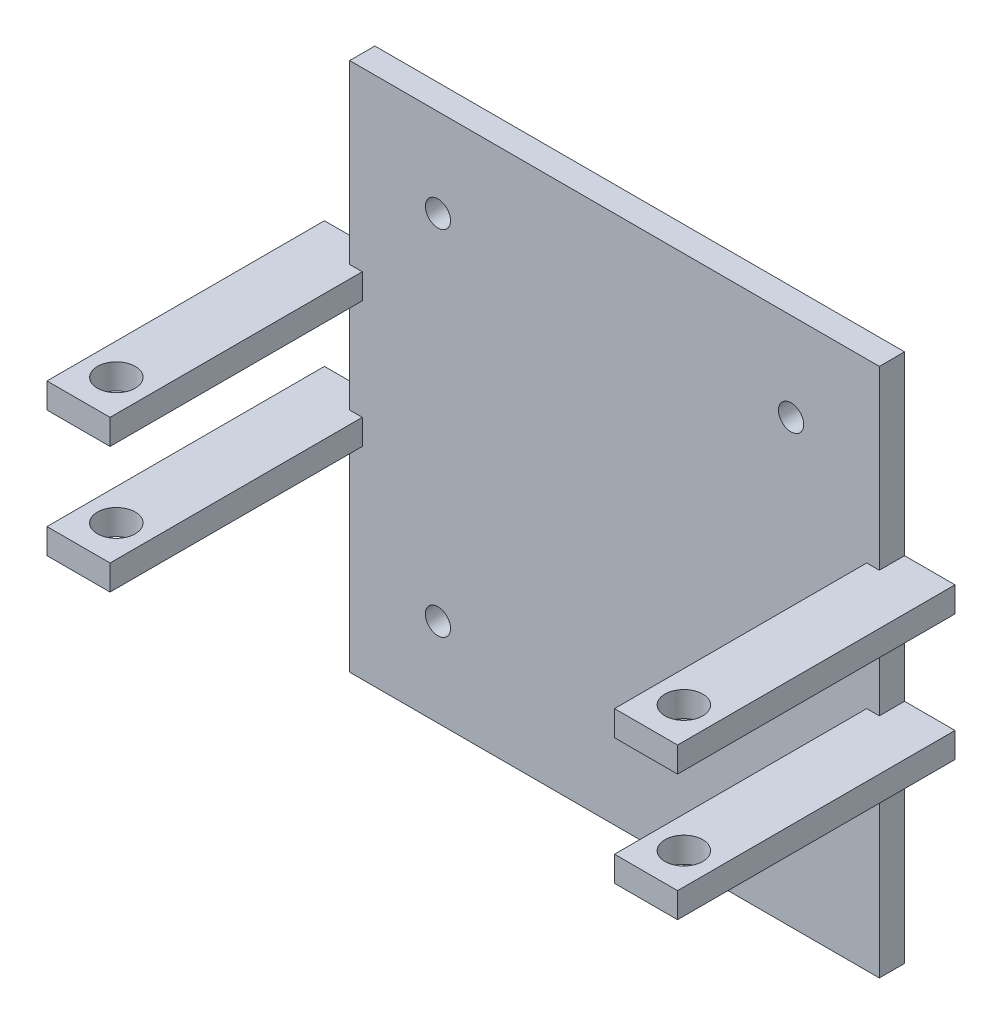
ISO-10303-21;
HEADER;
FILE_DESCRIPTION(('STEP AP214'),'2;1');
FILE_NAME('part.step','',(''),(''),'','','');
FILE_SCHEMA(('AUTOMOTIVE_DESIGN { 1 0 10303 214 1 1 1 1 }'));
ENDSEC;
DATA;
#1=APPLICATION_CONTEXT('core data for automotive mechanical design processes');
#2=APPLICATION_PROTOCOL_DEFINITION('international standard','automotive_design',2000,#1);
#3=PRODUCT_CONTEXT('',#1,'mechanical');
#4=PRODUCT('Part','Part','',(#3));
#5=PRODUCT_RELATED_PRODUCT_CATEGORY('part','',(#4));
#6=PRODUCT_DEFINITION_FORMATION('','',#4);
#7=PRODUCT_DEFINITION_CONTEXT('part definition',#1,'design');
#8=PRODUCT_DEFINITION('design','',#6,#7);
#9=PRODUCT_DEFINITION_SHAPE('','',#8);
#10=(LENGTH_UNIT() NAMED_UNIT(*) SI_UNIT(.MILLI.,.METRE.));
#11=(NAMED_UNIT(*) PLANE_ANGLE_UNIT() SI_UNIT($,.RADIAN.));
#12=(NAMED_UNIT(*) SI_UNIT($,.STERADIAN.) SOLID_ANGLE_UNIT());
#13=UNCERTAINTY_MEASURE_WITH_UNIT(LENGTH_MEASURE(1.E-05),#10,'distance_accuracy_value','');
#14=(GEOMETRIC_REPRESENTATION_CONTEXT(3) GLOBAL_UNCERTAINTY_ASSIGNED_CONTEXT((#13)) GLOBAL_UNIT_ASSIGNED_CONTEXT((#10,
#11,#12)) REPRESENTATION_CONTEXT('',''));
#15=CARTESIAN_POINT('',(0.,0.,0.));
#16=DIRECTION('',(0.,0.,1.));
#17=DIRECTION('',(1.,0.,0.));
#18=AXIS2_PLACEMENT_3D('',#15,#16,#17);
#19=CARTESIAN_POINT('',(-25.8385690789474,-6.14671052631578,0.));
#20=DIRECTION('',(0.,-1.,0.));
#21=DIRECTION('',(0.,0.,-1.));
#22=AXIS2_PLACEMENT_3D('',#19,#20,#21);
#23=PLANE('',#22);
#24=CARTESIAN_POINT('',(-23.3385690789474,-6.14671052631578,19.));
#25=DIRECTION('',(0.,-1.,0.));
#26=DIRECTION('',(0.,0.,-1.));
#27=AXIS2_PLACEMENT_3D('',#24,#25,#26);
#28=CIRCLE('',#27,1.5);
#29=CARTESIAN_POINT('',(-23.3385690789474,-6.14671052631578,17.5));
#30=VERTEX_POINT('',#29);
#31=EDGE_CURVE('E242',#30,#30,#28,.T.);
#32=ORIENTED_EDGE('',*,*,#31,.T.);
#33=EDGE_LOOP('',(#32));
#34=FACE_BOUND('',#33,.T.);
#35=DIRECTION('',(1.,0.,0.));
#36=VECTOR('',#35,1.);
#37=CARTESIAN_POINT('',(-25.8385690789474,-6.14671052631578,22.));
#38=LINE('',#37,#36);
#39=CARTESIAN_POINT('',(-25.8385690789474,-6.14671052631578,22.));
#40=VERTEX_POINT('',#39);
#41=CARTESIAN_POINT('',(-20.8385690789474,-6.14671052631578,22.));
#42=VERTEX_POINT('',#41);
#43=EDGE_CURVE('E267',#40,#42,#38,.T.);
#44=ORIENTED_EDGE('',*,*,#43,.T.);
#45=DIRECTION('',(0.,0.,1.));
#46=VECTOR('',#45,1.);
#47=CARTESIAN_POINT('',(-20.8385690789474,-6.14671052631578,-38.0499687890016));
#48=LINE('',#47,#46);
#49=CARTESIAN_POINT('',(-20.8385690789474,-6.14671052631578,2.));
#50=VERTEX_POINT('',#49);
#51=EDGE_CURVE('E235',#50,#42,#48,.T.);
#52=ORIENTED_EDGE('',*,*,#51,.F.);
#53=DIRECTION('',(1.,0.,0.));
#54=VECTOR('',#53,1.);
#55=CARTESIAN_POINT('',(0.,-6.14671052631578,2.));
#56=LINE('',#55,#54);
#57=CARTESIAN_POINT('',(-21.8385690789474,-6.14671052631578,2.));
#58=VERTEX_POINT('',#57);
#59=EDGE_CURVE('E312',#58,#50,#56,.T.);
#60=ORIENTED_EDGE('',*,*,#59,.F.);
#61=DIRECTION('',(0.,0.,-1.));
#62=VECTOR('',#61,1.);
#63=CARTESIAN_POINT('',(-21.8385690789474,-6.14671052631578,2.));
#64=LINE('',#63,#62);
#65=CARTESIAN_POINT('',(-21.8385690789474,-6.14671052631578,0.));
#66=VERTEX_POINT('',#65);
#67=EDGE_CURVE('E320',#58,#66,#64,.T.);
#68=ORIENTED_EDGE('',*,*,#67,.T.);
#69=DIRECTION('',(1.,0.,0.));
#70=VECTOR('',#69,1.);
#71=CARTESIAN_POINT('',(-25.8385690789474,-6.14671052631578,0.));
#72=LINE('',#71,#70);
#73=CARTESIAN_POINT('',(-25.8385690789474,-6.14671052631578,0.));
#74=VERTEX_POINT('',#73);
#75=EDGE_CURVE('E284',#74,#66,#72,.T.);
#76=ORIENTED_EDGE('',*,*,#75,.F.);
#77=DIRECTION('',(0.,0.,1.));
#78=VECTOR('',#77,1.);
#79=CARTESIAN_POINT('',(-25.8385690789474,-6.14671052631578,0.));
#80=LINE('',#79,#78);
#81=EDGE_CURVE('E289',#74,#40,#80,.T.);
#82=ORIENTED_EDGE('',*,*,#81,.T.);
#83=EDGE_LOOP('',(#44,#52,#60,#68,#76,#82));
#84=FACE_BOUND('',#83,.T.);
#85=ADVANCED_FACE('F41',(#34,#84),#23,.F.);
#86=CARTESIAN_POINT('',(-25.8385690789474,-8.14671052631578,0.));
#87=DIRECTION('',(0.,-1.,0.));
#88=DIRECTION('',(0.,0.,-1.));
#89=AXIS2_PLACEMENT_3D('',#86,#87,#88);
#90=PLANE('',#89);
#91=CARTESIAN_POINT('',(-23.3385690789474,-8.14671052631578,19.));
#92=DIRECTION('',(0.,-1.,0.));
#93=DIRECTION('',(0.,0.,-1.));
#94=AXIS2_PLACEMENT_3D('',#91,#92,#93);
#95=CIRCLE('',#94,1.5);
#96=CARTESIAN_POINT('',(-23.3385690789474,-8.14671052631578,17.5));
#97=VERTEX_POINT('',#96);
#98=EDGE_CURVE('E504',#97,#97,#95,.T.);
#99=ORIENTED_EDGE('',*,*,#98,.F.);
#100=EDGE_LOOP('',(#99));
#101=FACE_BOUND('',#100,.T.);
#102=DIRECTION('',(0.,0.,1.));
#103=VECTOR('',#102,1.);
#104=CARTESIAN_POINT('',(-20.8385690789474,-8.14671052631578,-38.0499687890016));
#105=LINE('',#104,#103);
#106=CARTESIAN_POINT('',(-20.8385690789474,-8.14671052631578,2.));
#107=VERTEX_POINT('',#106);
#108=CARTESIAN_POINT('',(-20.8385690789474,-8.14671052631578,22.));
#109=VERTEX_POINT('',#108);
#110=EDGE_CURVE('E232',#107,#109,#105,.T.);
#111=ORIENTED_EDGE('',*,*,#110,.T.);
#112=DIRECTION('',(1.,0.,0.));
#113=VECTOR('',#112,1.);
#114=CARTESIAN_POINT('',(-25.8385690789474,-8.14671052631578,22.));
#115=LINE('',#114,#113);
#116=CARTESIAN_POINT('',(-25.8385690789474,-8.14671052631578,22.));
#117=VERTEX_POINT('',#116);
#118=EDGE_CURVE('E247',#117,#109,#115,.T.);
#119=ORIENTED_EDGE('',*,*,#118,.F.);
#120=DIRECTION('',(0.,0.,1.));
#121=VECTOR('',#120,1.);
#122=CARTESIAN_POINT('',(-25.8385690789474,-8.14671052631578,0.));
#123=LINE('',#122,#121);
#124=CARTESIAN_POINT('',(-25.8385690789474,-8.14671052631578,0.));
#125=VERTEX_POINT('',#124);
#126=EDGE_CURVE('E288',#125,#117,#123,.T.);
#127=ORIENTED_EDGE('',*,*,#126,.F.);
#128=DIRECTION('',(1.,0.,0.));
#129=VECTOR('',#128,1.);
#130=CARTESIAN_POINT('',(-25.8385690789474,-8.14671052631578,0.));
#131=LINE('',#130,#129);
#132=CARTESIAN_POINT('',(-21.8385690789474,-8.14671052631578,0.));
#133=VERTEX_POINT('',#132);
#134=EDGE_CURVE('E275',#125,#133,#131,.T.);
#135=ORIENTED_EDGE('',*,*,#134,.T.);
#136=DIRECTION('',(0.,0.,-1.));
#137=VECTOR('',#136,1.);
#138=CARTESIAN_POINT('',(-21.8385690789474,-8.14671052631578,2.));
#139=LINE('',#138,#137);
#140=CARTESIAN_POINT('',(-21.8385690789474,-8.14671052631578,2.));
#141=VERTEX_POINT('',#140);
#142=EDGE_CURVE('E309',#141,#133,#139,.T.);
#143=ORIENTED_EDGE('',*,*,#142,.F.);
#144=DIRECTION('',(1.,0.,0.));
#145=VECTOR('',#144,1.);
#146=CARTESIAN_POINT('',(0.,-8.14671052631578,2.));
#147=LINE('',#146,#145);
#148=EDGE_CURVE('E250',#141,#107,#147,.T.);
#149=ORIENTED_EDGE('',*,*,#148,.T.);
#150=EDGE_LOOP('',(#111,#119,#127,#135,#143,#149));
#151=FACE_BOUND('',#150,.T.);
#152=ADVANCED_FACE('F246',(#101,#151),#90,.T.);
#153=CARTESIAN_POINT('',(0.,-10.,22.));
#154=DIRECTION('',(0.,0.,1.));
#155=DIRECTION('',(1.,0.,0.));
#156=AXIS2_PLACEMENT_3D('',#153,#154,#155);
#157=PLANE('',#156);
#158=DIRECTION('',(0.,-1.,0.));
#159=VECTOR('',#158,1.);
#160=CARTESIAN_POINT('',(-20.8385690789474,-6.14671052631578,22.));
#161=LINE('',#160,#159);
#162=EDGE_CURVE('E229',#42,#109,#161,.T.);
#163=ORIENTED_EDGE('',*,*,#162,.F.);
#164=ORIENTED_EDGE('',*,*,#43,.F.);
#165=DIRECTION('',(0.,-1.,0.));
#166=VECTOR('',#165,1.);
#167=CARTESIAN_POINT('',(-25.8385690789474,-6.14671052631578,22.));
#168=LINE('',#167,#166);
#169=EDGE_CURVE('E255',#40,#117,#168,.T.);
#170=ORIENTED_EDGE('',*,*,#169,.T.);
#171=ORIENTED_EDGE('',*,*,#118,.T.);
#172=EDGE_LOOP('',(#163,#164,#170,#171));
#173=FACE_BOUND('',#172,.T.);
#174=ADVANCED_FACE('F253',(#173),#157,.T.);
#175=CARTESIAN_POINT('',(-21.8385690789474,17.8532894736842,2.));
#176=DIRECTION('',(1.,0.,0.));
#177=DIRECTION('',(0.,1.,0.));
#178=AXIS2_PLACEMENT_3D('',#175,#176,#177);
#179=PLANE('',#178);
#180=ORIENTED_EDGE('',*,*,#67,.F.);
#181=DIRECTION('',(0.,-1.,0.));
#182=VECTOR('',#181,1.);
#183=CARTESIAN_POINT('',(-21.8385690789474,17.8532894736842,2.));
#184=LINE('',#183,#182);
#185=CARTESIAN_POINT('',(-21.8385690789474,1.85328947368422,2.));
#186=VERTEX_POINT('',#185);
#187=EDGE_CURVE('E447',#186,#58,#184,.T.);
#188=ORIENTED_EDGE('',*,*,#187,.F.);
#189=DIRECTION('',(0.,0.,-1.));
#190=VECTOR('',#189,1.);
#191=CARTESIAN_POINT('',(-21.8385690789474,1.85328947368422,2.));
#192=LINE('',#191,#190);
#193=CARTESIAN_POINT('',(-21.8385690789474,1.85328947368422,0.));
#194=VERTEX_POINT('',#193);
#195=EDGE_CURVE('E409',#186,#194,#192,.T.);
#196=ORIENTED_EDGE('',*,*,#195,.T.);
#197=DIRECTION('',(0.,-1.,0.));
#198=VECTOR('',#197,1.);
#199=CARTESIAN_POINT('',(-21.8385690789474,17.8532894736842,0.));
#200=LINE('',#199,#198);
#201=EDGE_CURVE('E465',#194,#66,#200,.T.);
#202=ORIENTED_EDGE('',*,*,#201,.T.);
#203=EDGE_LOOP('',(#180,#188,#196,#202));
#204=FACE_BOUND('',#203,.T.);
#205=ADVANCED_FACE('F620',(#204),#179,.F.);
#206=CARTESIAN_POINT('',(20.1614309210526,17.8532894736842,2.));
#207=DIRECTION('',(-1.,0.,0.));
#208=DIRECTION('',(0.,-1.,0.));
#209=AXIS2_PLACEMENT_3D('',#206,#207,#208);
#210=PLANE('',#209);
#211=DIRECTION('',(0.,0.,1.));
#212=VECTOR('',#211,1.);
#213=CARTESIAN_POINT('',(20.1614309210526,-6.14671052631578,2.));
#214=LINE('',#213,#212);
#215=CARTESIAN_POINT('',(20.1614309210526,-6.14671052631578,0.));
#216=VERTEX_POINT('',#215);
#217=CARTESIAN_POINT('',(20.1614309210526,-6.14671052631578,2.));
#218=VERTEX_POINT('',#217);
#219=EDGE_CURVE('E316',#216,#218,#214,.T.);
#220=ORIENTED_EDGE('',*,*,#219,.F.);
#221=DIRECTION('',(0.,1.,0.));
#222=VECTOR('',#221,1.);
#223=CARTESIAN_POINT('',(20.1614309210526,17.8532894736842,0.));
#224=LINE('',#223,#222);
#225=CARTESIAN_POINT('',(20.1614309210526,1.85328947368422,0.));
#226=VERTEX_POINT('',#225);
#227=EDGE_CURVE('E473',#216,#226,#224,.T.);
#228=ORIENTED_EDGE('',*,*,#227,.T.);
#229=DIRECTION('',(0.,0.,1.));
#230=VECTOR('',#229,1.);
#231=CARTESIAN_POINT('',(20.1614309210526,1.85328947368422,2.));
#232=LINE('',#231,#230);
#233=CARTESIAN_POINT('',(20.1614309210526,1.85328947368422,2.));
#234=VERTEX_POINT('',#233);
#235=EDGE_CURVE('E405',#226,#234,#232,.T.);
#236=ORIENTED_EDGE('',*,*,#235,.T.);
#237=DIRECTION('',(0.,1.,0.));
#238=VECTOR('',#237,1.);
#239=CARTESIAN_POINT('',(20.1614309210526,17.8532894736842,2.));
#240=LINE('',#239,#238);
#241=EDGE_CURVE('E457',#218,#234,#240,.T.);
#242=ORIENTED_EDGE('',*,*,#241,.F.);
#243=EDGE_LOOP('',(#220,#228,#236,#242));
#244=FACE_BOUND('',#243,.T.);
#245=ADVANCED_FACE('F582',(#244),#210,.F.);
#246=CARTESIAN_POINT('',(-25.8385690789474,3.85328947368422,0.));
#247=DIRECTION('',(0.,-1.,0.));
#248=DIRECTION('',(0.,0.,-1.));
#249=AXIS2_PLACEMENT_3D('',#246,#247,#248);
#250=PLANE('',#249);
#251=CARTESIAN_POINT('',(-23.3385690789474,3.85328947368422,19.));
#252=DIRECTION('',(0.,1.,0.));
#253=DIRECTION('',(0.,0.,1.));
#254=AXIS2_PLACEMENT_3D('',#251,#252,#253);
#255=CIRCLE('',#254,1.5);
#256=CARTESIAN_POINT('',(-23.3385690789474,3.85328947368422,20.5));
#257=VERTEX_POINT('',#256);
#258=EDGE_CURVE('E505',#257,#257,#255,.T.);
#259=ORIENTED_EDGE('',*,*,#258,.F.);
#260=EDGE_LOOP('',(#259));
#261=FACE_BOUND('',#260,.T.);
#262=DIRECTION('',(1.,0.,0.));
#263=VECTOR('',#262,1.);
#264=CARTESIAN_POINT('',(-25.8385690789474,3.85328947368422,22.));
#265=LINE('',#264,#263);
#266=CARTESIAN_POINT('',(-25.8385690789474,3.85328947368422,22.));
#267=VERTEX_POINT('',#266);
#268=CARTESIAN_POINT('',(-20.8385690789474,3.85328947368422,22.));
#269=VERTEX_POINT('',#268);
#270=EDGE_CURVE('E364',#267,#269,#265,.T.);
#271=ORIENTED_EDGE('',*,*,#270,.T.);
#272=DIRECTION('',(0.,0.,1.));
#273=VECTOR('',#272,1.);
#274=CARTESIAN_POINT('',(-20.8385690789474,3.85328947368422,-38.0499687890016));
#275=LINE('',#274,#273);
#276=CARTESIAN_POINT('',(-20.8385690789474,3.85328947368422,2.));
#277=VERTEX_POINT('',#276);
#278=EDGE_CURVE('E329',#277,#269,#275,.T.);
#279=ORIENTED_EDGE('',*,*,#278,.F.);
#280=DIRECTION('',(1.,0.,0.));
#281=VECTOR('',#280,1.);
#282=CARTESIAN_POINT('',(0.,3.85328947368422,2.));
#283=LINE('',#282,#281);
#284=CARTESIAN_POINT('',(-21.8385690789474,3.85328947368422,2.));
#285=VERTEX_POINT('',#284);
#286=EDGE_CURVE('E413',#285,#277,#283,.T.);
#287=ORIENTED_EDGE('',*,*,#286,.F.);
#288=DIRECTION('',(0.,0.,-1.));
#289=VECTOR('',#288,1.);
#290=CARTESIAN_POINT('',(-21.8385690789474,3.85328947368422,2.));
#291=LINE('',#290,#289);
#292=CARTESIAN_POINT('',(-21.8385690789474,3.85328947368422,0.));
#293=VERTEX_POINT('',#292);
#294=EDGE_CURVE('E421',#285,#293,#291,.T.);
#295=ORIENTED_EDGE('',*,*,#294,.T.);
#296=DIRECTION('',(1.,0.,0.));
#297=VECTOR('',#296,1.);
#298=CARTESIAN_POINT('',(-25.8385690789474,3.85328947368422,0.));
#299=LINE('',#298,#297);
#300=CARTESIAN_POINT('',(-25.8385690789474,3.85328947368422,0.));
#301=VERTEX_POINT('',#300);
#302=EDGE_CURVE('E382',#301,#293,#299,.T.);
#303=ORIENTED_EDGE('',*,*,#302,.F.);
#304=DIRECTION('',(0.,0.,1.));
#305=VECTOR('',#304,1.);
#306=CARTESIAN_POINT('',(-25.8385690789474,3.85328947368422,0.));
#307=LINE('',#306,#305);
#308=EDGE_CURVE('E387',#301,#267,#307,.T.);
#309=ORIENTED_EDGE('',*,*,#308,.T.);
#310=EDGE_LOOP('',(#271,#279,#287,#295,#303,#309));
#311=FACE_BOUND('',#310,.T.);
#312=ADVANCED_FACE('F633',(#261,#311),#250,.F.);
#313=CARTESIAN_POINT('',(-25.8385690789474,1.85328947368422,0.));
#314=DIRECTION('',(0.,-1.,0.));
#315=DIRECTION('',(0.,0.,-1.));
#316=AXIS2_PLACEMENT_3D('',#313,#314,#315);
#317=PLANE('',#316);
#318=CARTESIAN_POINT('',(-23.3385690789474,1.85328947368422,19.));
#319=DIRECTION('',(0.,-1.,0.));
#320=DIRECTION('',(0.,0.,-1.));
#321=AXIS2_PLACEMENT_3D('',#318,#319,#320);
#322=CIRCLE('',#321,1.5);
#323=CARTESIAN_POINT('',(-23.3385690789474,1.85328947368422,17.5));
#324=VERTEX_POINT('',#323);
#325=EDGE_CURVE('E501',#324,#324,#322,.T.);
#326=ORIENTED_EDGE('',*,*,#325,.F.);
#327=EDGE_LOOP('',(#326));
#328=FACE_BOUND('',#327,.T.);
#329=DIRECTION('',(0.,0.,1.));
#330=VECTOR('',#329,1.);
#331=CARTESIAN_POINT('',(-20.8385690789474,1.85328947368422,-38.0499687890016));
#332=LINE('',#331,#330);
#333=CARTESIAN_POINT('',(-20.8385690789474,1.85328947368422,2.));
#334=VERTEX_POINT('',#333);
#335=CARTESIAN_POINT('',(-20.8385690789474,1.85328947368422,22.));
#336=VERTEX_POINT('',#335);
#337=EDGE_CURVE('E338',#334,#336,#332,.T.);
#338=ORIENTED_EDGE('',*,*,#337,.T.);
#339=DIRECTION('',(1.,0.,0.));
#340=VECTOR('',#339,1.);
#341=CARTESIAN_POINT('',(-25.8385690789474,1.85328947368422,22.));
#342=LINE('',#341,#340);
#343=CARTESIAN_POINT('',(-25.8385690789474,1.85328947368422,22.));
#344=VERTEX_POINT('',#343);
#345=EDGE_CURVE('E355',#344,#336,#342,.T.);
#346=ORIENTED_EDGE('',*,*,#345,.F.);
#347=DIRECTION('',(0.,0.,1.));
#348=VECTOR('',#347,1.);
#349=CARTESIAN_POINT('',(-25.8385690789474,1.85328947368422,0.));
#350=LINE('',#349,#348);
#351=CARTESIAN_POINT('',(-25.8385690789474,1.85328947368422,0.));
#352=VERTEX_POINT('',#351);
#353=EDGE_CURVE('E386',#352,#344,#350,.T.);
#354=ORIENTED_EDGE('',*,*,#353,.F.);
#355=DIRECTION('',(1.,0.,0.));
#356=VECTOR('',#355,1.);
#357=CARTESIAN_POINT('',(-25.8385690789474,1.85328947368422,0.));
#358=LINE('',#357,#356);
#359=EDGE_CURVE('E373',#352,#194,#358,.T.);
#360=ORIENTED_EDGE('',*,*,#359,.T.);
#361=ORIENTED_EDGE('',*,*,#195,.F.);
#362=DIRECTION('',(1.,0.,0.));
#363=VECTOR('',#362,1.);
#364=CARTESIAN_POINT('',(0.,1.85328947368422,2.));
#365=LINE('',#364,#363);
#366=EDGE_CURVE('E401',#186,#334,#365,.T.);
#367=ORIENTED_EDGE('',*,*,#366,.T.);
#368=EDGE_LOOP('',(#338,#346,#354,#360,#361,#367));
#369=FACE_BOUND('',#368,.T.);
#370=ADVANCED_FACE('F624',(#328,#369),#317,.T.);
#371=CARTESIAN_POINT('',(0.,0.,22.));
#372=DIRECTION('',(0.,0.,1.));
#373=DIRECTION('',(1.,0.,0.));
#374=AXIS2_PLACEMENT_3D('',#371,#372,#373);
#375=PLANE('',#374);
#376=DIRECTION('',(0.,-1.,0.));
#377=VECTOR('',#376,1.);
#378=CARTESIAN_POINT('',(-20.8385690789474,3.85328947368422,22.));
#379=LINE('',#378,#377);
#380=EDGE_CURVE('E324',#269,#336,#379,.T.);
#381=ORIENTED_EDGE('',*,*,#380,.F.);
#382=ORIENTED_EDGE('',*,*,#270,.F.);
#383=DIRECTION('',(0.,-1.,0.));
#384=VECTOR('',#383,1.);
#385=CARTESIAN_POINT('',(-25.8385690789474,3.85328947368422,22.));
#386=LINE('',#385,#384);
#387=EDGE_CURVE('E332',#267,#344,#386,.T.);
#388=ORIENTED_EDGE('',*,*,#387,.T.);
#389=ORIENTED_EDGE('',*,*,#345,.T.);
#390=EDGE_LOOP('',(#381,#382,#388,#389));
#391=FACE_BOUND('',#390,.T.);
#392=ADVANCED_FACE('F671',(#391),#375,.T.);
#393=ORIENTED_EDGE('',*,*,#294,.F.);
#394=CARTESIAN_POINT('',(-21.8385690789474,17.8532894736842,2.));
#395=VERTEX_POINT('',#394);
#396=EDGE_CURVE('E442',#395,#285,#184,.T.);
#397=ORIENTED_EDGE('',*,*,#396,.F.);
#398=DIRECTION('',(0.,0.,-1.));
#399=VECTOR('',#398,1.);
#400=CARTESIAN_POINT('',(-21.8385690789474,17.8532894736842,2.));
#401=LINE('',#400,#399);
#402=CARTESIAN_POINT('',(-21.8385690789474,17.8532894736842,0.));
#403=VERTEX_POINT('',#402);
#404=EDGE_CURVE('E460',#395,#403,#401,.T.);
#405=ORIENTED_EDGE('',*,*,#404,.T.);
#406=EDGE_CURVE('E461',#403,#293,#200,.T.);
#407=ORIENTED_EDGE('',*,*,#406,.T.);
#408=EDGE_LOOP('',(#393,#397,#405,#407));
#409=FACE_BOUND('',#408,.T.);
#410=ADVANCED_FACE('F639',(#409),#179,.F.);
#411=DIRECTION('',(0.,0.,1.));
#412=VECTOR('',#411,1.);
#413=CARTESIAN_POINT('',(20.1614309210526,3.85328947368422,2.));
#414=LINE('',#413,#412);
#415=CARTESIAN_POINT('',(20.1614309210526,3.85328947368422,0.));
#416=VERTEX_POINT('',#415);
#417=CARTESIAN_POINT('',(20.1614309210526,3.85328947368422,2.));
#418=VERTEX_POINT('',#417);
#419=EDGE_CURVE('E417',#416,#418,#414,.T.);
#420=ORIENTED_EDGE('',*,*,#419,.F.);
#421=CARTESIAN_POINT('',(20.1614309210526,17.8532894736842,0.));
#422=VERTEX_POINT('',#421);
#423=EDGE_CURVE('E468',#416,#422,#224,.T.);
#424=ORIENTED_EDGE('',*,*,#423,.T.);
#425=DIRECTION('',(0.,0.,-1.));
#426=VECTOR('',#425,1.);
#427=CARTESIAN_POINT('',(20.1614309210526,17.8532894736842,2.));
#428=LINE('',#427,#426);
#429=CARTESIAN_POINT('',(20.1614309210526,17.8532894736842,2.));
#430=VERTEX_POINT('',#429);
#431=EDGE_CURVE('E479',#430,#422,#428,.T.);
#432=ORIENTED_EDGE('',*,*,#431,.F.);
#433=EDGE_CURVE('E451',#418,#430,#240,.T.);
#434=ORIENTED_EDGE('',*,*,#433,.F.);
#435=EDGE_LOOP('',(#420,#424,#432,#434));
#436=FACE_BOUND('',#435,.T.);
#437=ADVANCED_FACE('F648',(#436),#210,.F.);
#438=CARTESIAN_POINT('',(13.1614309210526,-17.1467105263158,0.));
#439=DIRECTION('',(0.,0.,1.));
#440=DIRECTION('',(1.,0.,0.));
#441=AXIS2_PLACEMENT_3D('',#438,#439,#440);
#442=CYLINDRICAL_SURFACE('',#441,1.);
#443=CARTESIAN_POINT('',(13.1614309210526,-17.1467105263158,0.));
#444=DIRECTION('',(0.,0.,1.));
#445=DIRECTION('',(1.,0.,0.));
#446=AXIS2_PLACEMENT_3D('',#443,#444,#445);
#447=CIRCLE('',#446,1.);
#448=CARTESIAN_POINT('',(14.1614309210526,-17.1467105263158,0.));
#449=VERTEX_POINT('',#448);
#450=EDGE_CURVE('E51',#449,#449,#447,.T.);
#451=ORIENTED_EDGE('',*,*,#450,.F.);
#452=EDGE_LOOP('',(#451));
#453=FACE_BOUND('',#452,.T.);
#454=CARTESIAN_POINT('',(13.1614309210526,-17.1467105263158,2.));
#455=DIRECTION('',(0.,0.,1.));
#456=DIRECTION('',(1.,0.,0.));
#457=AXIS2_PLACEMENT_3D('',#454,#455,#456);
#458=CIRCLE('',#457,1.);
#459=CARTESIAN_POINT('',(14.1614309210526,-17.1467105263158,2.));
#460=VERTEX_POINT('',#459);
#461=EDGE_CURVE('E11',#460,#460,#458,.T.);
#462=ORIENTED_EDGE('',*,*,#461,.T.);
#463=EDGE_LOOP('',(#462));
#464=FACE_BOUND('',#463,.T.);
#465=ADVANCED_FACE('F43',(#453,#464),#442,.F.);
#466=CARTESIAN_POINT('',(13.1614309210526,10.8532894736842,0.));
#467=DIRECTION('',(0.,0.,1.));
#468=DIRECTION('',(1.,0.,0.));
#469=AXIS2_PLACEMENT_3D('',#466,#467,#468);
#470=CYLINDRICAL_SURFACE('',#469,1.);
#471=CARTESIAN_POINT('',(13.1614309210526,10.8532894736842,0.));
#472=DIRECTION('',(0.,0.,1.));
#473=DIRECTION('',(1.,0.,0.));
#474=AXIS2_PLACEMENT_3D('',#471,#472,#473);
#475=CIRCLE('',#474,1.);
#476=CARTESIAN_POINT('',(14.1614309210526,10.8532894736842,0.));
#477=VERTEX_POINT('',#476);
#478=EDGE_CURVE('E491',#477,#477,#475,.T.);
#479=ORIENTED_EDGE('',*,*,#478,.F.);
#480=EDGE_LOOP('',(#479));
#481=FACE_BOUND('',#480,.T.);
#482=CARTESIAN_POINT('',(13.1614309210526,10.8532894736842,2.));
#483=DIRECTION('',(0.,0.,1.));
#484=DIRECTION('',(1.,0.,0.));
#485=AXIS2_PLACEMENT_3D('',#482,#483,#484);
#486=CIRCLE('',#485,1.);
#487=CARTESIAN_POINT('',(14.1614309210526,10.8532894736842,2.));
#488=VERTEX_POINT('',#487);
#489=EDGE_CURVE('E495',#488,#488,#486,.T.);
#490=ORIENTED_EDGE('',*,*,#489,.T.);
#491=EDGE_LOOP('',(#490));
#492=FACE_BOUND('',#491,.T.);
#493=ADVANCED_FACE('F748',(#481,#492),#470,.F.);
#494=CARTESIAN_POINT('',(-21.8385690789474,-24.1467105263158,2.));
#495=VERTEX_POINT('',#494);
#496=EDGE_CURVE('E448',#141,#495,#184,.T.);
#497=ORIENTED_EDGE('',*,*,#496,.F.);
#498=ORIENTED_EDGE('',*,*,#142,.T.);
#499=CARTESIAN_POINT('',(-21.8385690789474,-24.1467105263158,0.));
#500=VERTEX_POINT('',#499);
#501=EDGE_CURVE('E438',#133,#500,#200,.T.);
#502=ORIENTED_EDGE('',*,*,#501,.T.);
#503=DIRECTION('',(0.,0.,-1.));
#504=VECTOR('',#503,1.);
#505=CARTESIAN_POINT('',(-21.8385690789474,-24.1467105263158,2.));
#506=LINE('',#505,#504);
#507=EDGE_CURVE('E487',#495,#500,#506,.T.);
#508=ORIENTED_EDGE('',*,*,#507,.F.);
#509=EDGE_LOOP('',(#497,#498,#502,#508));
#510=FACE_BOUND('',#509,.T.);
#511=ADVANCED_FACE('F679',(#510),#179,.F.);
#512=CARTESIAN_POINT('',(-21.8385690789474,-24.1467105263158,2.));
#513=DIRECTION('',(0.,1.,0.));
#514=DIRECTION('',(0.,0.,1.));
#515=AXIS2_PLACEMENT_3D('',#512,#513,#514);
#516=PLANE('',#515);
#517=DIRECTION('',(1.,0.,0.));
#518=VECTOR('',#517,1.);
#519=CARTESIAN_POINT('',(-21.8385690789474,-24.1467105263158,0.));
#520=LINE('',#519,#518);
#521=CARTESIAN_POINT('',(20.1614309210526,-24.1467105263158,0.));
#522=VERTEX_POINT('',#521);
#523=EDGE_CURVE('E464',#500,#522,#520,.T.);
#524=ORIENTED_EDGE('',*,*,#523,.T.);
#525=DIRECTION('',(0.,0.,-1.));
#526=VECTOR('',#525,1.);
#527=CARTESIAN_POINT('',(20.1614309210526,-24.1467105263158,2.));
#528=LINE('',#527,#526);
#529=CARTESIAN_POINT('',(20.1614309210526,-24.1467105263158,2.));
#530=VERTEX_POINT('',#529);
#531=EDGE_CURVE('E483',#530,#522,#528,.T.);
#532=ORIENTED_EDGE('',*,*,#531,.F.);
#533=DIRECTION('',(1.,0.,0.));
#534=VECTOR('',#533,1.);
#535=CARTESIAN_POINT('',(-21.8385690789474,-24.1467105263158,2.));
#536=LINE('',#535,#534);
#537=EDGE_CURVE('E446',#495,#530,#536,.T.);
#538=ORIENTED_EDGE('',*,*,#537,.F.);
#539=ORIENTED_EDGE('',*,*,#507,.T.);
#540=EDGE_LOOP('',(#524,#532,#538,#539));
#541=FACE_BOUND('',#540,.T.);
#542=ADVANCED_FACE('F606',(#541),#516,.F.);
#543=CARTESIAN_POINT('',(20.1614309210526,-8.14671052631578,0.));
#544=VERTEX_POINT('',#543);
#545=EDGE_CURVE('E469',#522,#544,#224,.T.);
#546=ORIENTED_EDGE('',*,*,#545,.T.);
#547=DIRECTION('',(0.,0.,1.));
#548=VECTOR('',#547,1.);
#549=CARTESIAN_POINT('',(20.1614309210526,-8.14671052631578,2.));
#550=LINE('',#549,#548);
#551=CARTESIAN_POINT('',(20.1614309210526,-8.14671052631578,2.));
#552=VERTEX_POINT('',#551);
#553=EDGE_CURVE('E305',#544,#552,#550,.T.);
#554=ORIENTED_EDGE('',*,*,#553,.T.);
#555=EDGE_CURVE('E452',#530,#552,#240,.T.);
#556=ORIENTED_EDGE('',*,*,#555,.F.);
#557=ORIENTED_EDGE('',*,*,#531,.T.);
#558=EDGE_LOOP('',(#546,#554,#556,#557));
#559=FACE_BOUND('',#558,.T.);
#560=ADVANCED_FACE('F602',(#559),#210,.F.);
#561=CARTESIAN_POINT('',(-21.8385690789474,17.8532894736842,2.));
#562=DIRECTION('',(0.,-1.,0.));
#563=DIRECTION('',(0.,0.,-1.));
#564=AXIS2_PLACEMENT_3D('',#561,#562,#563);
#565=PLANE('',#564);
#566=DIRECTION('',(-1.,0.,0.));
#567=VECTOR('',#566,1.);
#568=CARTESIAN_POINT('',(-21.8385690789474,17.8532894736842,0.));
#569=LINE('',#568,#567);
#570=EDGE_CURVE('E472',#422,#403,#569,.T.);
#571=ORIENTED_EDGE('',*,*,#570,.T.);
#572=ORIENTED_EDGE('',*,*,#404,.F.);
#573=DIRECTION('',(-1.,0.,0.));
#574=VECTOR('',#573,1.);
#575=CARTESIAN_POINT('',(-21.8385690789474,17.8532894736842,2.));
#576=LINE('',#575,#574);
#577=EDGE_CURVE('E456',#430,#395,#576,.T.);
#578=ORIENTED_EDGE('',*,*,#577,.F.);
#579=ORIENTED_EDGE('',*,*,#431,.T.);
#580=EDGE_LOOP('',(#571,#572,#578,#579));
#581=FACE_BOUND('',#580,.T.);
#582=ADVANCED_FACE('F644',(#581),#565,.F.);
#583=CARTESIAN_POINT('',(0.,0.,2.));
#584=DIRECTION('',(0.,0.,1.));
#585=DIRECTION('',(1.,0.,0.));
#586=AXIS2_PLACEMENT_3D('',#583,#584,#585);
#587=PLANE('',#586);
#588=ORIENTED_EDGE('',*,*,#148,.F.);
#589=ORIENTED_EDGE('',*,*,#496,.T.);
#590=ORIENTED_EDGE('',*,*,#537,.T.);
#591=ORIENTED_EDGE('',*,*,#555,.T.);
#592=CARTESIAN_POINT('',(19.1614309210526,-8.14671052631578,2.));
#593=VERTEX_POINT('',#592);
#594=EDGE_CURVE('E292',#593,#552,#147,.T.);
#595=ORIENTED_EDGE('',*,*,#594,.F.);
#596=DIRECTION('',(0.,-1.,0.));
#597=VECTOR('',#596,1.);
#598=CARTESIAN_POINT('',(19.1614309210526,-6.14671052631578,2.));
#599=LINE('',#598,#597);
#600=CARTESIAN_POINT('',(19.1614309210526,-6.14671052631578,2.));
#601=VERTEX_POINT('',#600);
#602=EDGE_CURVE('E526',#601,#593,#599,.T.);
#603=ORIENTED_EDGE('',*,*,#602,.F.);
#604=EDGE_CURVE('E67',#601,#218,#56,.T.);
#605=ORIENTED_EDGE('',*,*,#604,.T.);
#606=ORIENTED_EDGE('',*,*,#241,.T.);
#607=CARTESIAN_POINT('',(19.1614309210526,1.85328947368422,2.));
#608=VERTEX_POINT('',#607);
#609=EDGE_CURVE('E390',#608,#234,#365,.T.);
#610=ORIENTED_EDGE('',*,*,#609,.F.);
#611=DIRECTION('',(0.,-1.,0.));
#612=VECTOR('',#611,1.);
#613=CARTESIAN_POINT('',(19.1614309210526,3.85328947368422,2.));
#614=LINE('',#613,#612);
#615=CARTESIAN_POINT('',(19.1614309210526,3.85328947368422,2.));
#616=VERTEX_POINT('',#615);
#617=EDGE_CURVE('E325',#616,#608,#614,.T.);
#618=ORIENTED_EDGE('',*,*,#617,.F.);
#619=EDGE_CURVE('E412',#616,#418,#283,.T.);
#620=ORIENTED_EDGE('',*,*,#619,.T.);
#621=ORIENTED_EDGE('',*,*,#433,.T.);
#622=ORIENTED_EDGE('',*,*,#577,.T.);
#623=ORIENTED_EDGE('',*,*,#396,.T.);
#624=ORIENTED_EDGE('',*,*,#286,.T.);
#625=DIRECTION('',(0.,1.,0.));
#626=VECTOR('',#625,1.);
#627=CARTESIAN_POINT('',(-20.8385690789474,3.85328947368422,2.));
#628=LINE('',#627,#626);
#629=EDGE_CURVE('E328',#334,#277,#628,.T.);
#630=ORIENTED_EDGE('',*,*,#629,.F.);
#631=ORIENTED_EDGE('',*,*,#366,.F.);
#632=ORIENTED_EDGE('',*,*,#187,.T.);
#633=ORIENTED_EDGE('',*,*,#59,.T.);
#634=DIRECTION('',(0.,1.,0.));
#635=VECTOR('',#634,1.);
#636=CARTESIAN_POINT('',(-20.8385690789474,-6.14671052631578,2.));
#637=LINE('',#636,#635);
#638=EDGE_CURVE('E529',#107,#50,#637,.T.);
#639=ORIENTED_EDGE('',*,*,#638,.F.);
#640=EDGE_LOOP('',(#588,#589,#590,#591,#595,#603,#605,#606,#610,#618,#620,#621,#622,#623,#624,
#630,#631,#632,#633,#639));
#641=FACE_BOUND('',#640,.T.);
#642=CARTESIAN_POINT('',(-14.8385690789474,-17.1467105263158,2.));
#643=DIRECTION('',(0.,0.,1.));
#644=DIRECTION('',(1.,0.,0.));
#645=AXIS2_PLACEMENT_3D('',#642,#643,#644);
#646=CIRCLE('',#645,1.);
#647=CARTESIAN_POINT('',(-13.8385690789474,-17.1467105263158,2.));
#648=VERTEX_POINT('',#647);
#649=EDGE_CURVE('E429',#648,#648,#646,.T.);
#650=ORIENTED_EDGE('',*,*,#649,.F.);
#651=EDGE_LOOP('',(#650));
#652=FACE_BOUND('',#651,.T.);
#653=ORIENTED_EDGE('',*,*,#461,.F.);
#654=EDGE_LOOP('',(#653));
#655=FACE_BOUND('',#654,.T.);
#656=CARTESIAN_POINT('',(-14.8385690789474,10.8532894736842,2.));
#657=DIRECTION('',(0.,0.,1.));
#658=DIRECTION('',(1.,0.,0.));
#659=AXIS2_PLACEMENT_3D('',#656,#657,#658);
#660=CIRCLE('',#659,1.);
#661=CARTESIAN_POINT('',(-13.8385690789474,10.8532894736842,2.));
#662=VERTEX_POINT('',#661);
#663=EDGE_CURVE('E433',#662,#662,#660,.T.);
#664=ORIENTED_EDGE('',*,*,#663,.F.);
#665=EDGE_LOOP('',(#664));
#666=FACE_BOUND('',#665,.T.);
#667=ORIENTED_EDGE('',*,*,#489,.F.);
#668=EDGE_LOOP('',(#667));
#669=FACE_BOUND('',#668,.T.);
#670=ADVANCED_FACE('F573',(#641,#652,#655,#666,#669),#587,.T.);
#671=CARTESIAN_POINT('',(0.,0.,0.));
#672=DIRECTION('',(0.,0.,1.));
#673=DIRECTION('',(1.,0.,0.));
#674=AXIS2_PLACEMENT_3D('',#671,#672,#673);
#675=PLANE('',#674);
#676=CARTESIAN_POINT('',(-14.8385690789474,-17.1467105263158,0.));
#677=DIRECTION('',(0.,0.,1.));
#678=DIRECTION('',(1.,0.,0.));
#679=AXIS2_PLACEMENT_3D('',#676,#677,#678);
#680=CIRCLE('',#679,1.);
#681=CARTESIAN_POINT('',(-13.8385690789474,-17.1467105263158,0.));
#682=VERTEX_POINT('',#681);
#683=EDGE_CURVE('E425',#682,#682,#680,.T.);
#684=ORIENTED_EDGE('',*,*,#683,.T.);
#685=EDGE_LOOP('',(#684));
#686=FACE_BOUND('',#685,.T.);
#687=ORIENTED_EDGE('',*,*,#501,.F.);
#688=ORIENTED_EDGE('',*,*,#134,.F.);
#689=DIRECTION('',(0.,-1.,0.));
#690=VECTOR('',#689,1.);
#691=CARTESIAN_POINT('',(-25.8385690789474,-6.14671052631578,0.));
#692=LINE('',#691,#690);
#693=EDGE_CURVE('E270',#74,#125,#692,.T.);
#694=ORIENTED_EDGE('',*,*,#693,.F.);
#695=ORIENTED_EDGE('',*,*,#75,.T.);
#696=ORIENTED_EDGE('',*,*,#201,.F.);
#697=ORIENTED_EDGE('',*,*,#359,.F.);
#698=DIRECTION('',(0.,-1.,0.));
#699=VECTOR('',#698,1.);
#700=CARTESIAN_POINT('',(-25.8385690789474,3.85328947368422,0.));
#701=LINE('',#700,#699);
#702=EDGE_CURVE('E368',#301,#352,#701,.T.);
#703=ORIENTED_EDGE('',*,*,#702,.F.);
#704=ORIENTED_EDGE('',*,*,#302,.T.);
#705=ORIENTED_EDGE('',*,*,#406,.F.);
#706=ORIENTED_EDGE('',*,*,#570,.F.);
#707=ORIENTED_EDGE('',*,*,#423,.F.);
#708=CARTESIAN_POINT('',(24.1614309210526,3.85328947368422,0.));
#709=VERTEX_POINT('',#708);
#710=EDGE_CURVE('E381',#416,#709,#299,.T.);
#711=ORIENTED_EDGE('',*,*,#710,.T.);
#712=DIRECTION('',(0.,-1.,0.));
#713=VECTOR('',#712,1.);
#714=CARTESIAN_POINT('',(24.1614309210526,3.85328947368422,0.));
#715=LINE('',#714,#713);
#716=CARTESIAN_POINT('',(24.1614309210526,1.85328947368422,0.));
#717=VERTEX_POINT('',#716);
#718=EDGE_CURVE('E377',#709,#717,#715,.T.);
#719=ORIENTED_EDGE('',*,*,#718,.T.);
#720=EDGE_CURVE('E372',#226,#717,#358,.T.);
#721=ORIENTED_EDGE('',*,*,#720,.F.);
#722=ORIENTED_EDGE('',*,*,#227,.F.);
#723=CARTESIAN_POINT('',(24.1614309210526,-6.14671052631578,0.));
#724=VERTEX_POINT('',#723);
#725=EDGE_CURVE('E283',#216,#724,#72,.T.);
#726=ORIENTED_EDGE('',*,*,#725,.T.);
#727=DIRECTION('',(0.,-1.,0.));
#728=VECTOR('',#727,1.);
#729=CARTESIAN_POINT('',(24.1614309210526,-6.14671052631578,0.));
#730=LINE('',#729,#728);
#731=CARTESIAN_POINT('',(24.1614309210526,-8.14671052631578,0.));
#732=VERTEX_POINT('',#731);
#733=EDGE_CURVE('E279',#724,#732,#730,.T.);
#734=ORIENTED_EDGE('',*,*,#733,.T.);
#735=EDGE_CURVE('E274',#544,#732,#131,.T.);
#736=ORIENTED_EDGE('',*,*,#735,.F.);
#737=ORIENTED_EDGE('',*,*,#545,.F.);
#738=ORIENTED_EDGE('',*,*,#523,.F.);
#739=EDGE_LOOP('',(#687,#688,#694,#695,#696,#697,#703,#704,#705,#706,#707,#711,#719,#721,#722,
#726,#734,#736,#737,#738));
#740=FACE_BOUND('',#739,.T.);
#741=ORIENTED_EDGE('',*,*,#450,.T.);
#742=EDGE_LOOP('',(#741));
#743=FACE_BOUND('',#742,.T.);
#744=CARTESIAN_POINT('',(-14.8385690789474,10.8532894736842,0.));
#745=DIRECTION('',(0.,0.,1.));
#746=DIRECTION('',(1.,0.,0.));
#747=AXIS2_PLACEMENT_3D('',#744,#745,#746);
#748=CIRCLE('',#747,1.);
#749=CARTESIAN_POINT('',(-13.8385690789474,10.8532894736842,0.));
#750=VERTEX_POINT('',#749);
#751=EDGE_CURVE('E434',#750,#750,#748,.T.);
#752=ORIENTED_EDGE('',*,*,#751,.T.);
#753=EDGE_LOOP('',(#752));
#754=FACE_BOUND('',#753,.T.);
#755=ORIENTED_EDGE('',*,*,#478,.T.);
#756=EDGE_LOOP('',(#755));
#757=FACE_BOUND('',#756,.T.);
#758=ADVANCED_FACE('F587',(#686,#740,#743,#754,#757),#675,.F.);
#759=CARTESIAN_POINT('',(-14.8385690789474,10.8532894736842,0.));
#760=DIRECTION('',(0.,0.,1.));
#761=DIRECTION('',(1.,0.,0.));
#762=AXIS2_PLACEMENT_3D('',#759,#760,#761);
#763=CYLINDRICAL_SURFACE('',#762,1.);
#764=ORIENTED_EDGE('',*,*,#751,.F.);
#765=EDGE_LOOP('',(#764));
#766=FACE_BOUND('',#765,.T.);
#767=ORIENTED_EDGE('',*,*,#663,.T.);
#768=EDGE_LOOP('',(#767));
#769=FACE_BOUND('',#768,.T.);
#770=ADVANCED_FACE('F724',(#766,#769),#763,.F.);
#771=CARTESIAN_POINT('',(-14.8385690789474,-17.1467105263158,0.));
#772=DIRECTION('',(0.,0.,1.));
#773=DIRECTION('',(1.,0.,0.));
#774=AXIS2_PLACEMENT_3D('',#771,#772,#773);
#775=CYLINDRICAL_SURFACE('',#774,1.);
#776=ORIENTED_EDGE('',*,*,#683,.F.);
#777=EDGE_LOOP('',(#776));
#778=FACE_BOUND('',#777,.T.);
#779=ORIENTED_EDGE('',*,*,#649,.T.);
#780=EDGE_LOOP('',(#779));
#781=FACE_BOUND('',#780,.T.);
#782=ADVANCED_FACE('F718',(#778,#781),#775,.F.);
#783=CARTESIAN_POINT('',(21.6614309210526,3.85328947368422,19.));
#784=DIRECTION('',(0.,1.,0.));
#785=DIRECTION('',(0.,0.,1.));
#786=AXIS2_PLACEMENT_3D('',#783,#784,#785);
#787=CIRCLE('',#786,1.5);
#788=CARTESIAN_POINT('',(21.6614309210526,3.85328947368422,20.5));
#789=VERTEX_POINT('',#788);
#790=EDGE_CURVE('E709',#789,#789,#787,.T.);
#791=ORIENTED_EDGE('',*,*,#790,.F.);
#792=EDGE_LOOP('',(#791));
#793=FACE_BOUND('',#792,.T.);
#794=ORIENTED_EDGE('',*,*,#619,.F.);
#795=DIRECTION('',(0.,0.,1.));
#796=VECTOR('',#795,1.);
#797=CARTESIAN_POINT('',(19.1614309210526,3.85328947368422,-38.0499687890016));
#798=LINE('',#797,#796);
#799=CARTESIAN_POINT('',(19.1614309210526,3.85328947368422,22.));
#800=VERTEX_POINT('',#799);
#801=EDGE_CURVE('E341',#616,#800,#798,.T.);
#802=ORIENTED_EDGE('',*,*,#801,.T.);
#803=CARTESIAN_POINT('',(24.1614309210526,3.85328947368422,22.));
#804=VERTEX_POINT('',#803);
#805=EDGE_CURVE('E363',#800,#804,#265,.T.);
#806=ORIENTED_EDGE('',*,*,#805,.T.);
#807=DIRECTION('',(0.,0.,1.));
#808=VECTOR('',#807,1.);
#809=CARTESIAN_POINT('',(24.1614309210526,3.85328947368422,0.));
#810=LINE('',#809,#808);
#811=EDGE_CURVE('E391',#709,#804,#810,.T.);
#812=ORIENTED_EDGE('',*,*,#811,.F.);
#813=ORIENTED_EDGE('',*,*,#710,.F.);
#814=ORIENTED_EDGE('',*,*,#419,.T.);
#815=EDGE_LOOP('',(#794,#802,#806,#812,#813,#814));
#816=FACE_BOUND('',#815,.T.);
#817=ADVANCED_FACE('F653',(#793,#816),#250,.F.);
#818=CARTESIAN_POINT('',(21.6614309210526,1.85328947368422,19.));
#819=DIRECTION('',(0.,-1.,0.));
#820=DIRECTION('',(0.,0.,-1.));
#821=AXIS2_PLACEMENT_3D('',#818,#819,#820);
#822=CIRCLE('',#821,1.5);
#823=CARTESIAN_POINT('',(21.6614309210526,1.85328947368422,17.5));
#824=VERTEX_POINT('',#823);
#825=EDGE_CURVE('E513',#824,#824,#822,.T.);
#826=ORIENTED_EDGE('',*,*,#825,.F.);
#827=EDGE_LOOP('',(#826));
#828=FACE_BOUND('',#827,.T.);
#829=DIRECTION('',(0.,0.,1.));
#830=VECTOR('',#829,1.);
#831=CARTESIAN_POINT('',(19.1614309210526,1.85328947368422,-38.0499687890016));
#832=LINE('',#831,#830);
#833=CARTESIAN_POINT('',(19.1614309210526,1.85328947368422,22.));
#834=VERTEX_POINT('',#833);
#835=EDGE_CURVE('E345',#608,#834,#832,.T.);
#836=ORIENTED_EDGE('',*,*,#835,.F.);
#837=ORIENTED_EDGE('',*,*,#609,.T.);
#838=ORIENTED_EDGE('',*,*,#235,.F.);
#839=ORIENTED_EDGE('',*,*,#720,.T.);
#840=DIRECTION('',(0.,0.,1.));
#841=VECTOR('',#840,1.);
#842=CARTESIAN_POINT('',(24.1614309210526,1.85328947368422,0.));
#843=LINE('',#842,#841);
#844=CARTESIAN_POINT('',(24.1614309210526,1.85328947368422,22.));
#845=VERTEX_POINT('',#844);
#846=EDGE_CURVE('E395',#717,#845,#843,.T.);
#847=ORIENTED_EDGE('',*,*,#846,.T.);
#848=EDGE_CURVE('E354',#834,#845,#342,.T.);
#849=ORIENTED_EDGE('',*,*,#848,.F.);
#850=EDGE_LOOP('',(#836,#837,#838,#839,#847,#849));
#851=FACE_BOUND('',#850,.T.);
#852=ADVANCED_FACE('F579',(#828,#851),#317,.T.);
#853=CARTESIAN_POINT('',(-25.8385690789474,3.85328947368422,0.));
#854=DIRECTION('',(-1.,0.,0.));
#855=DIRECTION('',(0.,0.,1.));
#856=AXIS2_PLACEMENT_3D('',#853,#854,#855);
#857=PLANE('',#856);
#858=ORIENTED_EDGE('',*,*,#353,.T.);
#859=ORIENTED_EDGE('',*,*,#387,.F.);
#860=ORIENTED_EDGE('',*,*,#308,.F.);
#861=ORIENTED_EDGE('',*,*,#702,.T.);
#862=EDGE_LOOP('',(#858,#859,#860,#861));
#863=FACE_BOUND('',#862,.T.);
#864=ADVANCED_FACE('F628',(#863),#857,.T.);
#865=CARTESIAN_POINT('',(24.1614309210526,3.85328947368422,0.));
#866=DIRECTION('',(-1.,0.,0.));
#867=DIRECTION('',(0.,0.,1.));
#868=AXIS2_PLACEMENT_3D('',#865,#866,#867);
#869=PLANE('',#868);
#870=ORIENTED_EDGE('',*,*,#811,.T.);
#871=DIRECTION('',(0.,-1.,0.));
#872=VECTOR('',#871,1.);
#873=CARTESIAN_POINT('',(24.1614309210526,3.85328947368422,22.));
#874=LINE('',#873,#872);
#875=EDGE_CURVE('E359',#804,#845,#874,.T.);
#876=ORIENTED_EDGE('',*,*,#875,.T.);
#877=ORIENTED_EDGE('',*,*,#846,.F.);
#878=ORIENTED_EDGE('',*,*,#718,.F.);
#879=EDGE_LOOP('',(#870,#876,#877,#878));
#880=FACE_BOUND('',#879,.T.);
#881=ADVANCED_FACE('F659',(#880),#869,.F.);
#882=DIRECTION('',(0.,1.,0.));
#883=VECTOR('',#882,1.);
#884=CARTESIAN_POINT('',(19.1614309210526,3.85328947368422,22.));
#885=LINE('',#884,#883);
#886=EDGE_CURVE('E335',#834,#800,#885,.T.);
#887=ORIENTED_EDGE('',*,*,#886,.F.);
#888=ORIENTED_EDGE('',*,*,#848,.T.);
#889=ORIENTED_EDGE('',*,*,#875,.F.);
#890=ORIENTED_EDGE('',*,*,#805,.F.);
#891=EDGE_LOOP('',(#887,#888,#889,#890));
#892=FACE_BOUND('',#891,.T.);
#893=ADVANCED_FACE('F662',(#892),#375,.T.);
#894=CARTESIAN_POINT('',(-20.8385690789474,3.85328947368422,-38.0499687890016));
#895=DIRECTION('',(-1.,0.,0.));
#896=DIRECTION('',(0.,0.,1.));
#897=AXIS2_PLACEMENT_3D('',#894,#895,#896);
#898=PLANE('',#897);
#899=ORIENTED_EDGE('',*,*,#629,.T.);
#900=ORIENTED_EDGE('',*,*,#278,.T.);
#901=ORIENTED_EDGE('',*,*,#380,.T.);
#902=ORIENTED_EDGE('',*,*,#337,.F.);
#903=EDGE_LOOP('',(#899,#900,#901,#902));
#904=FACE_BOUND('',#903,.T.);
#905=ADVANCED_FACE('F669',(#904),#898,.F.);
#906=CARTESIAN_POINT('',(19.1614309210526,3.85328947368422,-38.0499687890016));
#907=DIRECTION('',(1.,0.,0.));
#908=DIRECTION('',(0.,1.,0.));
#909=AXIS2_PLACEMENT_3D('',#906,#907,#908);
#910=PLANE('',#909);
#911=ORIENTED_EDGE('',*,*,#617,.T.);
#912=ORIENTED_EDGE('',*,*,#835,.T.);
#913=ORIENTED_EDGE('',*,*,#886,.T.);
#914=ORIENTED_EDGE('',*,*,#801,.F.);
#915=EDGE_LOOP('',(#911,#912,#913,#914));
#916=FACE_BOUND('',#915,.T.);
#917=ADVANCED_FACE('F665',(#916),#910,.F.);
#918=CARTESIAN_POINT('',(21.6614309210526,-6.14671052631578,19.));
#919=DIRECTION('',(0.,-1.,0.));
#920=DIRECTION('',(0.,0.,-1.));
#921=AXIS2_PLACEMENT_3D('',#918,#919,#920);
#922=CIRCLE('',#921,1.5);
#923=CARTESIAN_POINT('',(21.6614309210526,-6.14671052631578,17.5));
#924=VERTEX_POINT('',#923);
#925=EDGE_CURVE('E519',#924,#924,#922,.T.);
#926=ORIENTED_EDGE('',*,*,#925,.T.);
#927=EDGE_LOOP('',(#926));
#928=FACE_BOUND('',#927,.T.);
#929=ORIENTED_EDGE('',*,*,#604,.F.);
#930=DIRECTION('',(0.,0.,1.));
#931=VECTOR('',#930,1.);
#932=CARTESIAN_POINT('',(19.1614309210526,-6.14671052631578,-38.0499687890016));
#933=LINE('',#932,#931);
#934=CARTESIAN_POINT('',(19.1614309210526,-6.14671052631578,22.));
#935=VERTEX_POINT('',#934);
#936=EDGE_CURVE('E536',#601,#935,#933,.T.);
#937=ORIENTED_EDGE('',*,*,#936,.T.);
#938=CARTESIAN_POINT('',(24.1614309210526,-6.14671052631578,22.));
#939=VERTEX_POINT('',#938);
#940=EDGE_CURVE('E263',#935,#939,#38,.T.);
#941=ORIENTED_EDGE('',*,*,#940,.T.);
#942=DIRECTION('',(0.,0.,1.));
#943=VECTOR('',#942,1.);
#944=CARTESIAN_POINT('',(24.1614309210526,-6.14671052631578,0.));
#945=LINE('',#944,#943);
#946=EDGE_CURVE('E293',#724,#939,#945,.T.);
#947=ORIENTED_EDGE('',*,*,#946,.F.);
#948=ORIENTED_EDGE('',*,*,#725,.F.);
#949=ORIENTED_EDGE('',*,*,#219,.T.);
#950=EDGE_LOOP('',(#929,#937,#941,#947,#948,#949));
#951=FACE_BOUND('',#950,.T.);
#952=ADVANCED_FACE('F545',(#928,#951),#23,.F.);
#953=CARTESIAN_POINT('',(21.6614309210526,-8.14671052631578,19.));
#954=DIRECTION('',(0.,-1.,0.));
#955=DIRECTION('',(0.,0.,-1.));
#956=AXIS2_PLACEMENT_3D('',#953,#954,#955);
#957=CIRCLE('',#956,1.5);
#958=CARTESIAN_POINT('',(21.6614309210526,-8.14671052631578,17.5));
#959=VERTEX_POINT('',#958);
#960=EDGE_CURVE('E45',#959,#959,#957,.T.);
#961=ORIENTED_EDGE('',*,*,#960,.F.);
#962=EDGE_LOOP('',(#961));
#963=FACE_BOUND('',#962,.T.);
#964=DIRECTION('',(0.,0.,1.));
#965=VECTOR('',#964,1.);
#966=CARTESIAN_POINT('',(19.1614309210526,-8.14671052631578,-38.0499687890016));
#967=LINE('',#966,#965);
#968=CARTESIAN_POINT('',(19.1614309210526,-8.14671052631578,22.));
#969=VERTEX_POINT('',#968);
#970=EDGE_CURVE('E59',#593,#969,#967,.T.);
#971=ORIENTED_EDGE('',*,*,#970,.F.);
#972=ORIENTED_EDGE('',*,*,#594,.T.);
#973=ORIENTED_EDGE('',*,*,#553,.F.);
#974=ORIENTED_EDGE('',*,*,#735,.T.);
#975=DIRECTION('',(0.,0.,1.));
#976=VECTOR('',#975,1.);
#977=CARTESIAN_POINT('',(24.1614309210526,-8.14671052631578,0.));
#978=LINE('',#977,#976);
#979=CARTESIAN_POINT('',(24.1614309210526,-8.14671052631578,22.));
#980=VERTEX_POINT('',#979);
#981=EDGE_CURVE('E297',#732,#980,#978,.T.);
#982=ORIENTED_EDGE('',*,*,#981,.T.);
#983=EDGE_CURVE('E258',#969,#980,#115,.T.);
#984=ORIENTED_EDGE('',*,*,#983,.F.);
#985=EDGE_LOOP('',(#971,#972,#973,#974,#982,#984));
#986=FACE_BOUND('',#985,.T.);
#987=ADVANCED_FACE('F598',(#963,#986),#90,.T.);
#988=CARTESIAN_POINT('',(-25.8385690789474,-6.14671052631578,0.));
#989=DIRECTION('',(-1.,0.,0.));
#990=DIRECTION('',(0.,0.,1.));
#991=AXIS2_PLACEMENT_3D('',#988,#989,#990);
#992=PLANE('',#991);
#993=ORIENTED_EDGE('',*,*,#126,.T.);
#994=ORIENTED_EDGE('',*,*,#169,.F.);
#995=ORIENTED_EDGE('',*,*,#81,.F.);
#996=ORIENTED_EDGE('',*,*,#693,.T.);
#997=EDGE_LOOP('',(#993,#994,#995,#996));
#998=FACE_BOUND('',#997,.T.);
#999=ADVANCED_FACE('F612',(#998),#992,.T.);
#1000=CARTESIAN_POINT('',(24.1614309210526,-6.14671052631578,0.));
#1001=DIRECTION('',(-1.,0.,0.));
#1002=DIRECTION('',(0.,0.,1.));
#1003=AXIS2_PLACEMENT_3D('',#1000,#1001,#1002);
#1004=PLANE('',#1003);
#1005=ORIENTED_EDGE('',*,*,#946,.T.);
#1006=DIRECTION('',(0.,-1.,0.));
#1007=VECTOR('',#1006,1.);
#1008=CARTESIAN_POINT('',(24.1614309210526,-6.14671052631578,22.));
#1009=LINE('',#1008,#1007);
#1010=EDGE_CURVE('E257',#939,#980,#1009,.T.);
#1011=ORIENTED_EDGE('',*,*,#1010,.T.);
#1012=ORIENTED_EDGE('',*,*,#981,.F.);
#1013=ORIENTED_EDGE('',*,*,#733,.F.);
#1014=EDGE_LOOP('',(#1005,#1011,#1012,#1013));
#1015=FACE_BOUND('',#1014,.T.);
#1016=ADVANCED_FACE('F592',(#1015),#1004,.F.);
#1017=DIRECTION('',(0.,1.,0.));
#1018=VECTOR('',#1017,1.);
#1019=CARTESIAN_POINT('',(19.1614309210526,-6.14671052631578,22.));
#1020=LINE('',#1019,#1018);
#1021=EDGE_CURVE('E241',#969,#935,#1020,.T.);
#1022=ORIENTED_EDGE('',*,*,#1021,.F.);
#1023=ORIENTED_EDGE('',*,*,#983,.T.);
#1024=ORIENTED_EDGE('',*,*,#1010,.F.);
#1025=ORIENTED_EDGE('',*,*,#940,.F.);
#1026=EDGE_LOOP('',(#1022,#1023,#1024,#1025));
#1027=FACE_BOUND('',#1026,.T.);
#1028=ADVANCED_FACE('F549',(#1027),#157,.T.);
#1029=CARTESIAN_POINT('',(-20.8385690789474,-6.14671052631578,-38.0499687890016));
#1030=DIRECTION('',(-1.,0.,0.));
#1031=DIRECTION('',(0.,0.,1.));
#1032=AXIS2_PLACEMENT_3D('',#1029,#1030,#1031);
#1033=PLANE('',#1032);
#1034=ORIENTED_EDGE('',*,*,#638,.T.);
#1035=ORIENTED_EDGE('',*,*,#51,.T.);
#1036=ORIENTED_EDGE('',*,*,#162,.T.);
#1037=ORIENTED_EDGE('',*,*,#110,.F.);
#1038=EDGE_LOOP('',(#1034,#1035,#1036,#1037));
#1039=FACE_BOUND('',#1038,.T.);
#1040=ADVANCED_FACE('F231',(#1039),#1033,.F.);
#1041=CARTESIAN_POINT('',(19.1614309210526,-6.14671052631578,-38.0499687890016));
#1042=DIRECTION('',(1.,0.,0.));
#1043=DIRECTION('',(0.,1.,0.));
#1044=AXIS2_PLACEMENT_3D('',#1041,#1042,#1043);
#1045=PLANE('',#1044);
#1046=ORIENTED_EDGE('',*,*,#602,.T.);
#1047=ORIENTED_EDGE('',*,*,#970,.T.);
#1048=ORIENTED_EDGE('',*,*,#1021,.T.);
#1049=ORIENTED_EDGE('',*,*,#936,.F.);
#1050=EDGE_LOOP('',(#1046,#1047,#1048,#1049));
#1051=FACE_BOUND('',#1050,.T.);
#1052=ADVANCED_FACE('F865',(#1051),#1045,.F.);
#1053=CARTESIAN_POINT('',(-23.3385690789474,-24.1467105263158,19.));
#1054=DIRECTION('',(0.,1.,0.));
#1055=DIRECTION('',(0.,0.,1.));
#1056=AXIS2_PLACEMENT_3D('',#1053,#1054,#1055);
#1057=CYLINDRICAL_SURFACE('',#1056,1.5);
#1058=ORIENTED_EDGE('',*,*,#325,.T.);
#1059=EDGE_LOOP('',(#1058));
#1060=FACE_BOUND('',#1059,.T.);
#1061=ORIENTED_EDGE('',*,*,#258,.T.);
#1062=EDGE_LOOP('',(#1061));
#1063=FACE_BOUND('',#1062,.T.);
#1064=ADVANCED_FACE('F873',(#1060,#1063),#1057,.F.);
#1065=ORIENTED_EDGE('',*,*,#98,.T.);
#1066=EDGE_LOOP('',(#1065));
#1067=FACE_BOUND('',#1066,.T.);
#1068=ORIENTED_EDGE('',*,*,#31,.F.);
#1069=EDGE_LOOP('',(#1068));
#1070=FACE_BOUND('',#1069,.T.);
#1071=ADVANCED_FACE('F903',(#1067,#1070),#1057,.F.);
#1072=CARTESIAN_POINT('',(21.6614309210526,-24.1467105263158,19.));
#1073=DIRECTION('',(0.,1.,0.));
#1074=DIRECTION('',(0.,0.,1.));
#1075=AXIS2_PLACEMENT_3D('',#1072,#1073,#1074);
#1076=CYLINDRICAL_SURFACE('',#1075,1.5);
#1077=ORIENTED_EDGE('',*,*,#960,.T.);
#1078=EDGE_LOOP('',(#1077));
#1079=FACE_BOUND('',#1078,.T.);
#1080=ORIENTED_EDGE('',*,*,#925,.F.);
#1081=EDGE_LOOP('',(#1080));
#1082=FACE_BOUND('',#1081,.T.);
#1083=ADVANCED_FACE('F911',(#1079,#1082),#1076,.F.);
#1084=ORIENTED_EDGE('',*,*,#825,.T.);
#1085=EDGE_LOOP('',(#1084));
#1086=FACE_BOUND('',#1085,.T.);
#1087=ORIENTED_EDGE('',*,*,#790,.T.);
#1088=EDGE_LOOP('',(#1087));
#1089=FACE_BOUND('',#1088,.T.);
#1090=ADVANCED_FACE('F715',(#1086,#1089),#1076,.F.);
#1091=CLOSED_SHELL('',(#85,#152,#174,#205,#245,#312,#370,#392,#410,#437,#465,#493,#511,#542,
#560,#582,#670,#758,#770,#782,#817,#852,#864,#881,#893,#905,#917,#952,#987,#999,#1016,#1028,
#1040,#1052,#1064,#1071,#1083,#1090));
#1092=MANIFOLD_SOLID_BREP('B2',#1091);
#1093=ADVANCED_BREP_SHAPE_REPRESENTATION('',(#18,#1092),#14);
#1094=SHAPE_DEFINITION_REPRESENTATION(#9,#1093);
ENDSEC;
END-ISO-10303-21;
